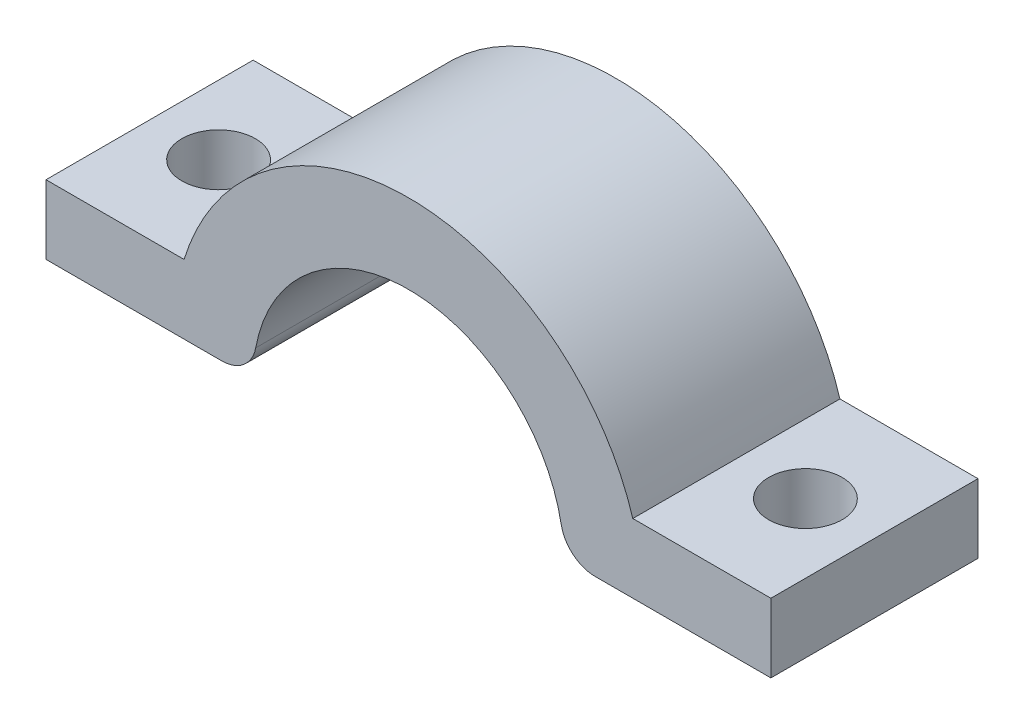
ISO-10303-21;
HEADER;
FILE_DESCRIPTION(('STEP AP214'),'2;1');
FILE_NAME('part.step','',(''),(''),'','','');
FILE_SCHEMA(('AUTOMOTIVE_DESIGN { 1 0 10303 214 1 1 1 1 }'));
ENDSEC;
DATA;
#1=APPLICATION_CONTEXT('core data for automotive mechanical design processes');
#2=APPLICATION_PROTOCOL_DEFINITION('international standard','automotive_design',2000,#1);
#3=PRODUCT_CONTEXT('',#1,'mechanical');
#4=PRODUCT('Part','Part','',(#3));
#5=PRODUCT_RELATED_PRODUCT_CATEGORY('part','',(#4));
#6=PRODUCT_DEFINITION_FORMATION('','',#4);
#7=PRODUCT_DEFINITION_CONTEXT('part definition',#1,'design');
#8=PRODUCT_DEFINITION('design','',#6,#7);
#9=PRODUCT_DEFINITION_SHAPE('','',#8);
#10=(LENGTH_UNIT() NAMED_UNIT(*) SI_UNIT(.MILLI.,.METRE.));
#11=(NAMED_UNIT(*) PLANE_ANGLE_UNIT() SI_UNIT($,.RADIAN.));
#12=(NAMED_UNIT(*) SI_UNIT($,.STERADIAN.) SOLID_ANGLE_UNIT());
#13=UNCERTAINTY_MEASURE_WITH_UNIT(LENGTH_MEASURE(1.E-05),#10,'distance_accuracy_value','');
#14=(GEOMETRIC_REPRESENTATION_CONTEXT(3) GLOBAL_UNCERTAINTY_ASSIGNED_CONTEXT((#13)) GLOBAL_UNIT_ASSIGNED_CONTEXT((#10,
#11,#12)) REPRESENTATION_CONTEXT('',''));
#15=CARTESIAN_POINT('',(0.,0.,0.));
#16=DIRECTION('',(0.,0.,1.));
#17=DIRECTION('',(1.,0.,0.));
#18=AXIS2_PLACEMENT_3D('',#15,#16,#17);
#19=CARTESIAN_POINT('',(0.,0.,19.05));
#20=DIRECTION('',(0.,0.,-1.));
#21=DIRECTION('',(-1.,0.,0.));
#22=AXIS2_PLACEMENT_3D('',#19,#20,#21);
#23=CYLINDRICAL_SURFACE('',#22,14.2875);
#24=CARTESIAN_POINT('',(0.,0.,19.05));
#25=DIRECTION('',(0.,0.,-1.));
#26=DIRECTION('',(-1.,0.,0.));
#27=AXIS2_PLACEMENT_3D('',#24,#25,#26);
#28=CIRCLE('',#27,14.2875);
#29=CARTESIAN_POINT('',(-14.0493583222341,2.59772727272727,19.05));
#30=VERTEX_POINT('',#29);
#31=CARTESIAN_POINT('',(14.0493583222341,2.59772727272727,19.05));
#32=VERTEX_POINT('',#31);
#33=EDGE_CURVE('E117',#30,#32,#28,.T.);
#34=ORIENTED_EDGE('',*,*,#33,.F.);
#35=DIRECTION('',(0.,0.,-1.));
#36=VECTOR('',#35,1.);
#37=CARTESIAN_POINT('',(-14.0493583222341,2.59772727272727,19.05));
#38=LINE('',#37,#36);
#39=CARTESIAN_POINT('',(-14.0493583222341,2.59772727272727,0.));
#40=VERTEX_POINT('',#39);
#41=EDGE_CURVE('E176',#30,#40,#38,.T.);
#42=ORIENTED_EDGE('',*,*,#41,.T.);
#43=CARTESIAN_POINT('',(0.,0.,0.));
#44=DIRECTION('',(0.,0.,-1.));
#45=DIRECTION('',(-1.,0.,0.));
#46=AXIS2_PLACEMENT_3D('',#43,#44,#45);
#47=CIRCLE('',#46,14.2875);
#48=CARTESIAN_POINT('',(14.0493583222341,2.59772727272727,0.));
#49=VERTEX_POINT('',#48);
#50=EDGE_CURVE('E146',#40,#49,#47,.T.);
#51=ORIENTED_EDGE('',*,*,#50,.T.);
#52=DIRECTION('',(0.,0.,-1.));
#53=VECTOR('',#52,1.);
#54=CARTESIAN_POINT('',(14.0493583222341,2.59772727272727,19.05));
#55=LINE('',#54,#53);
#56=EDGE_CURVE('E126',#49,#32,#55,.F.);
#57=ORIENTED_EDGE('',*,*,#56,.T.);
#58=EDGE_LOOP('',(#34,#42,#51,#57));
#59=FACE_BOUND('',#58,.T.);
#60=ADVANCED_FACE('F32',(#59),#23,.F.);
#61=CARTESIAN_POINT('',(14.2875,0.,19.05));
#62=DIRECTION('',(0.,1.,0.));
#63=DIRECTION('',(0.,0.,1.));
#64=AXIS2_PLACEMENT_3D('',#61,#62,#63);
#65=PLANE('',#64);
#66=CARTESIAN_POINT('',(26.9875,0.,9.525));
#67=DIRECTION('',(0.,1.,0.));
#68=DIRECTION('',(-1.,0.,0.));
#69=AXIS2_PLACEMENT_3D('',#66,#67,#68);
#70=CIRCLE('',#69,3.3782);
#71=CARTESIAN_POINT('',(23.6093,0.,9.525));
#72=VERTEX_POINT('',#71);
#73=EDGE_CURVE('E149',#72,#72,#70,.T.);
#74=ORIENTED_EDGE('',*,*,#73,.T.);
#75=EDGE_LOOP('',(#74));
#76=FACE_BOUND('',#75,.T.);
#77=DIRECTION('',(1.,0.,0.));
#78=VECTOR('',#77,1.);
#79=CARTESIAN_POINT('',(14.2875,0.,19.05));
#80=LINE('',#79,#78);
#81=CARTESIAN_POINT('',(17.1714379493972,0.,19.05));
#82=VERTEX_POINT('',#81);
#83=CARTESIAN_POINT('',(33.3375,0.,19.05));
#84=VERTEX_POINT('',#83);
#85=EDGE_CURVE('E109',#82,#84,#80,.T.);
#86=ORIENTED_EDGE('',*,*,#85,.F.);
#87=DIRECTION('',(0.,0.,-1.));
#88=VECTOR('',#87,1.);
#89=CARTESIAN_POINT('',(17.1714379493972,0.,19.05));
#90=LINE('',#89,#88);
#91=CARTESIAN_POINT('',(17.1714379493972,0.,0.));
#92=VERTEX_POINT('',#91);
#93=EDGE_CURVE('E11',#82,#92,#90,.T.);
#94=ORIENTED_EDGE('',*,*,#93,.T.);
#95=DIRECTION('',(1.,0.,0.));
#96=VECTOR('',#95,1.);
#97=CARTESIAN_POINT('',(14.2875,0.,0.));
#98=LINE('',#97,#96);
#99=CARTESIAN_POINT('',(33.3375,0.,0.));
#100=VERTEX_POINT('',#99);
#101=EDGE_CURVE('E123',#92,#100,#98,.T.);
#102=ORIENTED_EDGE('',*,*,#101,.T.);
#103=DIRECTION('',(0.,0.,-1.));
#104=VECTOR('',#103,1.);
#105=CARTESIAN_POINT('',(33.3375,0.,19.05));
#106=LINE('',#105,#104);
#107=EDGE_CURVE('E120',#84,#100,#106,.T.);
#108=ORIENTED_EDGE('',*,*,#107,.F.);
#109=EDGE_LOOP('',(#86,#94,#102,#108));
#110=FACE_BOUND('',#109,.T.);
#111=ADVANCED_FACE('F121',(#76,#110),#65,.F.);
#112=CARTESIAN_POINT('',(33.3375,0.,19.05));
#113=DIRECTION('',(-1.,0.,0.));
#114=DIRECTION('',(0.,0.,1.));
#115=AXIS2_PLACEMENT_3D('',#112,#113,#114);
#116=PLANE('',#115);
#117=DIRECTION('',(0.,1.,0.));
#118=VECTOR('',#117,1.);
#119=CARTESIAN_POINT('',(33.3375,0.,0.));
#120=LINE('',#119,#118);
#121=CARTESIAN_POINT('',(33.3375,6.35,0.));
#122=VERTEX_POINT('',#121);
#123=EDGE_CURVE('E151',#100,#122,#120,.T.);
#124=ORIENTED_EDGE('',*,*,#123,.T.);
#125=DIRECTION('',(0.,0.,-1.));
#126=VECTOR('',#125,1.);
#127=CARTESIAN_POINT('',(33.3375,6.35,19.05));
#128=LINE('',#127,#126);
#129=CARTESIAN_POINT('',(33.3375,6.35,19.05));
#130=VERTEX_POINT('',#129);
#131=EDGE_CURVE('E127',#130,#122,#128,.T.);
#132=ORIENTED_EDGE('',*,*,#131,.F.);
#133=DIRECTION('',(0.,1.,0.));
#134=VECTOR('',#133,1.);
#135=CARTESIAN_POINT('',(33.3375,0.,19.05));
#136=LINE('',#135,#134);
#137=EDGE_CURVE('E113',#84,#130,#136,.T.);
#138=ORIENTED_EDGE('',*,*,#137,.F.);
#139=ORIENTED_EDGE('',*,*,#107,.T.);
#140=EDGE_LOOP('',(#124,#132,#138,#139));
#141=FACE_BOUND('',#140,.T.);
#142=ADVANCED_FACE('F129',(#141),#116,.F.);
#143=CARTESIAN_POINT('',(33.3375,6.35,19.05));
#144=DIRECTION('',(0.,-1.,0.));
#145=DIRECTION('',(1.,0.,0.));
#146=AXIS2_PLACEMENT_3D('',#143,#144,#145);
#147=PLANE('',#146);
#148=CARTESIAN_POINT('',(26.9875,6.35,9.525));
#149=DIRECTION('',(0.,1.,0.));
#150=DIRECTION('',(-1.,0.,0.));
#151=AXIS2_PLACEMENT_3D('',#148,#149,#150);
#152=CIRCLE('',#151,3.3782);
#153=CARTESIAN_POINT('',(23.6093,6.35,9.525));
#154=VERTEX_POINT('',#153);
#155=EDGE_CURVE('E261',#154,#154,#152,.T.);
#156=ORIENTED_EDGE('',*,*,#155,.F.);
#157=EDGE_LOOP('',(#156));
#158=FACE_BOUND('',#157,.T.);
#159=DIRECTION('',(-1.,0.,0.));
#160=VECTOR('',#159,1.);
#161=CARTESIAN_POINT('',(33.3375,6.35,0.));
#162=LINE('',#161,#160);
#163=CARTESIAN_POINT('',(20.6375,6.35,0.));
#164=VERTEX_POINT('',#163);
#165=EDGE_CURVE('E153',#122,#164,#162,.T.);
#166=ORIENTED_EDGE('',*,*,#165,.T.);
#167=DIRECTION('',(0.,0.,-1.));
#168=VECTOR('',#167,1.);
#169=CARTESIAN_POINT('',(20.6375,6.35,19.05));
#170=LINE('',#169,#168);
#171=CARTESIAN_POINT('',(20.6375,6.35,19.05));
#172=VERTEX_POINT('',#171);
#173=EDGE_CURVE('E171',#172,#164,#170,.T.);
#174=ORIENTED_EDGE('',*,*,#173,.F.);
#175=DIRECTION('',(-1.,0.,0.));
#176=VECTOR('',#175,1.);
#177=CARTESIAN_POINT('',(33.3375,6.35,19.05));
#178=LINE('',#177,#176);
#179=EDGE_CURVE('E132',#130,#172,#178,.T.);
#180=ORIENTED_EDGE('',*,*,#179,.F.);
#181=ORIENTED_EDGE('',*,*,#131,.T.);
#182=EDGE_LOOP('',(#166,#174,#180,#181));
#183=FACE_BOUND('',#182,.T.);
#184=ADVANCED_FACE('F214',(#158,#183),#147,.F.);
#185=CARTESIAN_POINT('',(0.,0.,19.05));
#186=DIRECTION('',(0.,0.,-1.));
#187=DIRECTION('',(-1.,0.,0.));
#188=AXIS2_PLACEMENT_3D('',#185,#186,#187);
#189=CYLINDRICAL_SURFACE('',#188,21.5923344326175);
#190=CARTESIAN_POINT('',(0.,0.,0.));
#191=DIRECTION('',(0.,0.,1.));
#192=DIRECTION('',(1.,0.,0.));
#193=AXIS2_PLACEMENT_3D('',#190,#191,#192);
#194=CIRCLE('',#193,21.5923344326175);
#195=CARTESIAN_POINT('',(-20.6375,6.34999999999999,0.));
#196=VERTEX_POINT('',#195);
#197=EDGE_CURVE('E155',#164,#196,#194,.T.);
#198=ORIENTED_EDGE('',*,*,#197,.T.);
#199=DIRECTION('',(0.,0.,-1.));
#200=VECTOR('',#199,1.);
#201=CARTESIAN_POINT('',(-20.6375,6.34999999999999,19.05));
#202=LINE('',#201,#200);
#203=CARTESIAN_POINT('',(-20.6375,6.34999999999999,19.05));
#204=VERTEX_POINT('',#203);
#205=EDGE_CURVE('E168',#204,#196,#202,.T.);
#206=ORIENTED_EDGE('',*,*,#205,.F.);
#207=CARTESIAN_POINT('',(0.,0.,19.05));
#208=DIRECTION('',(0.,0.,1.));
#209=DIRECTION('',(1.,0.,0.));
#210=AXIS2_PLACEMENT_3D('',#207,#208,#209);
#211=CIRCLE('',#210,21.5923344326175);
#212=EDGE_CURVE('E134',#172,#204,#211,.T.);
#213=ORIENTED_EDGE('',*,*,#212,.F.);
#214=ORIENTED_EDGE('',*,*,#173,.T.);
#215=EDGE_LOOP('',(#198,#206,#213,#214));
#216=FACE_BOUND('',#215,.T.);
#217=ADVANCED_FACE('F211',(#216),#189,.T.);
#218=CARTESIAN_POINT('',(-33.3375,6.35,19.05));
#219=DIRECTION('',(0.,-1.,0.));
#220=DIRECTION('',(1.,0.,0.));
#221=AXIS2_PLACEMENT_3D('',#218,#219,#220);
#222=PLANE('',#221);
#223=CARTESIAN_POINT('',(-26.9875,6.34999999999999,9.525));
#224=DIRECTION('',(0.,1.,0.));
#225=DIRECTION('',(-1.,0.,0.));
#226=AXIS2_PLACEMENT_3D('',#223,#224,#225);
#227=CIRCLE('',#226,3.3782);
#228=CARTESIAN_POINT('',(-30.3657,6.34999999999999,9.525));
#229=VERTEX_POINT('',#228);
#230=EDGE_CURVE('E266',#229,#229,#227,.T.);
#231=ORIENTED_EDGE('',*,*,#230,.F.);
#232=EDGE_LOOP('',(#231));
#233=FACE_BOUND('',#232,.T.);
#234=DIRECTION('',(-1.,0.,0.));
#235=VECTOR('',#234,1.);
#236=CARTESIAN_POINT('',(-33.3375,6.35,0.));
#237=LINE('',#236,#235);
#238=CARTESIAN_POINT('',(-33.3375,6.35,0.));
#239=VERTEX_POINT('',#238);
#240=EDGE_CURVE('E157',#196,#239,#237,.T.);
#241=ORIENTED_EDGE('',*,*,#240,.T.);
#242=DIRECTION('',(0.,0.,-1.));
#243=VECTOR('',#242,1.);
#244=CARTESIAN_POINT('',(-33.3375,6.35,19.05));
#245=LINE('',#244,#243);
#246=CARTESIAN_POINT('',(-33.3375,6.35,19.05));
#247=VERTEX_POINT('',#246);
#248=EDGE_CURVE('E165',#247,#239,#245,.T.);
#249=ORIENTED_EDGE('',*,*,#248,.F.);
#250=DIRECTION('',(-1.,0.,0.));
#251=VECTOR('',#250,1.);
#252=CARTESIAN_POINT('',(-33.3375,6.35,19.05));
#253=LINE('',#252,#251);
#254=EDGE_CURVE('E139',#204,#247,#253,.T.);
#255=ORIENTED_EDGE('',*,*,#254,.F.);
#256=ORIENTED_EDGE('',*,*,#205,.T.);
#257=EDGE_LOOP('',(#241,#249,#255,#256));
#258=FACE_BOUND('',#257,.T.);
#259=ADVANCED_FACE('F206',(#233,#258),#222,.F.);
#260=CARTESIAN_POINT('',(-33.3375,0.,19.05));
#261=DIRECTION('',(1.,0.,0.));
#262=DIRECTION('',(0.,0.,-1.));
#263=AXIS2_PLACEMENT_3D('',#260,#261,#262);
#264=PLANE('',#263);
#265=DIRECTION('',(0.,-1.,0.));
#266=VECTOR('',#265,1.);
#267=CARTESIAN_POINT('',(-33.3375,0.,0.));
#268=LINE('',#267,#266);
#269=CARTESIAN_POINT('',(-33.3375,0.,0.));
#270=VERTEX_POINT('',#269);
#271=EDGE_CURVE('E159',#239,#270,#268,.T.);
#272=ORIENTED_EDGE('',*,*,#271,.T.);
#273=DIRECTION('',(0.,0.,-1.));
#274=VECTOR('',#273,1.);
#275=CARTESIAN_POINT('',(-33.3375,0.,19.05));
#276=LINE('',#275,#274);
#277=CARTESIAN_POINT('',(-33.3375,0.,19.05));
#278=VERTEX_POINT('',#277);
#279=EDGE_CURVE('E145',#278,#270,#276,.T.);
#280=ORIENTED_EDGE('',*,*,#279,.F.);
#281=DIRECTION('',(0.,-1.,0.));
#282=VECTOR('',#281,1.);
#283=CARTESIAN_POINT('',(-33.3375,0.,19.05));
#284=LINE('',#283,#282);
#285=EDGE_CURVE('E141',#247,#278,#284,.T.);
#286=ORIENTED_EDGE('',*,*,#285,.F.);
#287=ORIENTED_EDGE('',*,*,#248,.T.);
#288=EDGE_LOOP('',(#272,#280,#286,#287));
#289=FACE_BOUND('',#288,.T.);
#290=ADVANCED_FACE('F200',(#289),#264,.F.);
#291=CARTESIAN_POINT('',(-14.2875,0.,19.05));
#292=DIRECTION('',(0.,1.,0.));
#293=DIRECTION('',(-1.,0.,0.));
#294=AXIS2_PLACEMENT_3D('',#291,#292,#293);
#295=PLANE('',#294);
#296=CARTESIAN_POINT('',(-26.9875,0.,9.525));
#297=DIRECTION('',(0.,1.,0.));
#298=DIRECTION('',(-1.,0.,0.));
#299=AXIS2_PLACEMENT_3D('',#296,#297,#298);
#300=CIRCLE('',#299,3.3782);
#301=CARTESIAN_POINT('',(-30.3657,0.,9.525));
#302=VERTEX_POINT('',#301);
#303=EDGE_CURVE('E262',#302,#302,#300,.T.);
#304=ORIENTED_EDGE('',*,*,#303,.T.);
#305=EDGE_LOOP('',(#304));
#306=FACE_BOUND('',#305,.T.);
#307=DIRECTION('',(1.,0.,0.));
#308=VECTOR('',#307,1.);
#309=CARTESIAN_POINT('',(-14.2875,0.,0.));
#310=LINE('',#309,#308);
#311=CARTESIAN_POINT('',(-17.1714379493972,0.,0.));
#312=VERTEX_POINT('',#311);
#313=EDGE_CURVE('E161',#270,#312,#310,.T.);
#314=ORIENTED_EDGE('',*,*,#313,.T.);
#315=DIRECTION('',(0.,0.,-1.));
#316=VECTOR('',#315,1.);
#317=CARTESIAN_POINT('',(-17.1714379493972,0.,19.05));
#318=LINE('',#317,#316);
#319=CARTESIAN_POINT('',(-17.1714379493972,0.,19.05));
#320=VERTEX_POINT('',#319);
#321=EDGE_CURVE('E55',#312,#320,#318,.F.);
#322=ORIENTED_EDGE('',*,*,#321,.T.);
#323=DIRECTION('',(1.,0.,0.));
#324=VECTOR('',#323,1.);
#325=CARTESIAN_POINT('',(-14.2875,0.,19.05));
#326=LINE('',#325,#324);
#327=EDGE_CURVE('E143',#278,#320,#326,.T.);
#328=ORIENTED_EDGE('',*,*,#327,.F.);
#329=ORIENTED_EDGE('',*,*,#279,.T.);
#330=EDGE_LOOP('',(#314,#322,#328,#329));
#331=FACE_BOUND('',#330,.T.);
#332=ADVANCED_FACE('F196',(#306,#331),#295,.F.);
#333=CARTESIAN_POINT('',(0.,0.,19.05));
#334=DIRECTION('',(0.,0.,-1.));
#335=DIRECTION('',(-1.,0.,0.));
#336=AXIS2_PLACEMENT_3D('',#333,#334,#335);
#337=PLANE('',#336);
#338=ORIENTED_EDGE('',*,*,#327,.T.);
#339=CARTESIAN_POINT('',(-17.1714379493972,3.175,19.05));
#340=DIRECTION('',(0.,0.,-1.));
#341=DIRECTION('',(-1.,0.,0.));
#342=AXIS2_PLACEMENT_3D('',#339,#340,#341);
#343=CIRCLE('',#342,3.175);
#344=EDGE_CURVE('E40',#320,#30,#343,.F.);
#345=ORIENTED_EDGE('',*,*,#344,.T.);
#346=ORIENTED_EDGE('',*,*,#33,.T.);
#347=CARTESIAN_POINT('',(17.1714379493972,3.175,19.05));
#348=DIRECTION('',(0.,0.,-1.));
#349=DIRECTION('',(-1.,0.,0.));
#350=AXIS2_PLACEMENT_3D('',#347,#348,#349);
#351=CIRCLE('',#350,3.175);
#352=EDGE_CURVE('E47',#32,#82,#351,.F.);
#353=ORIENTED_EDGE('',*,*,#352,.T.);
#354=ORIENTED_EDGE('',*,*,#85,.T.);
#355=ORIENTED_EDGE('',*,*,#137,.T.);
#356=ORIENTED_EDGE('',*,*,#179,.T.);
#357=ORIENTED_EDGE('',*,*,#212,.T.);
#358=ORIENTED_EDGE('',*,*,#254,.T.);
#359=ORIENTED_EDGE('',*,*,#285,.T.);
#360=EDGE_LOOP('',(#338,#345,#346,#353,#354,#355,#356,#357,#358,#359));
#361=FACE_BOUND('',#360,.T.);
#362=ADVANCED_FACE('F111',(#361),#337,.F.);
#363=CARTESIAN_POINT('',(0.,0.,0.));
#364=DIRECTION('',(0.,0.,-1.));
#365=DIRECTION('',(-1.,0.,0.));
#366=AXIS2_PLACEMENT_3D('',#363,#364,#365);
#367=PLANE('',#366);
#368=ORIENTED_EDGE('',*,*,#50,.F.);
#369=CARTESIAN_POINT('',(-17.1714379493972,3.175,0.));
#370=DIRECTION('',(0.,0.,-1.));
#371=DIRECTION('',(-1.,0.,0.));
#372=AXIS2_PLACEMENT_3D('',#369,#370,#371);
#373=CIRCLE('',#372,3.175);
#374=EDGE_CURVE('E181',#40,#312,#373,.T.);
#375=ORIENTED_EDGE('',*,*,#374,.T.);
#376=ORIENTED_EDGE('',*,*,#313,.F.);
#377=ORIENTED_EDGE('',*,*,#271,.F.);
#378=ORIENTED_EDGE('',*,*,#240,.F.);
#379=ORIENTED_EDGE('',*,*,#197,.F.);
#380=ORIENTED_EDGE('',*,*,#165,.F.);
#381=ORIENTED_EDGE('',*,*,#123,.F.);
#382=ORIENTED_EDGE('',*,*,#101,.F.);
#383=CARTESIAN_POINT('',(17.1714379493972,3.175,0.));
#384=DIRECTION('',(0.,0.,-1.));
#385=DIRECTION('',(-1.,0.,0.));
#386=AXIS2_PLACEMENT_3D('',#383,#384,#385);
#387=CIRCLE('',#386,3.175);
#388=EDGE_CURVE('E179',#92,#49,#387,.T.);
#389=ORIENTED_EDGE('',*,*,#388,.T.);
#390=EDGE_LOOP('',(#368,#375,#376,#377,#378,#379,#380,#381,#382,#389));
#391=FACE_BOUND('',#390,.T.);
#392=ADVANCED_FACE('F194',(#391),#367,.T.);
#393=CARTESIAN_POINT('',(-26.9875,0.,9.525));
#394=DIRECTION('',(0.,1.,0.));
#395=DIRECTION('',(-1.,0.,0.));
#396=AXIS2_PLACEMENT_3D('',#393,#394,#395);
#397=CYLINDRICAL_SURFACE('',#396,3.3782);
#398=ORIENTED_EDGE('',*,*,#303,.F.);
#399=EDGE_LOOP('',(#398));
#400=FACE_BOUND('',#399,.T.);
#401=ORIENTED_EDGE('',*,*,#230,.T.);
#402=EDGE_LOOP('',(#401));
#403=FACE_BOUND('',#402,.T.);
#404=ADVANCED_FACE('F247',(#400,#403),#397,.F.);
#405=CARTESIAN_POINT('',(26.9875,0.,9.525));
#406=DIRECTION('',(0.,1.,0.));
#407=DIRECTION('',(-1.,0.,0.));
#408=AXIS2_PLACEMENT_3D('',#405,#406,#407);
#409=CYLINDRICAL_SURFACE('',#408,3.3782);
#410=ORIENTED_EDGE('',*,*,#73,.F.);
#411=EDGE_LOOP('',(#410));
#412=FACE_BOUND('',#411,.T.);
#413=ORIENTED_EDGE('',*,*,#155,.T.);
#414=EDGE_LOOP('',(#413));
#415=FACE_BOUND('',#414,.T.);
#416=ADVANCED_FACE('F220',(#412,#415),#409,.F.);
#417=CARTESIAN_POINT('',(-17.1714379493972,3.175,19.05));
#418=DIRECTION('',(0.,0.,-1.));
#419=DIRECTION('',(-1.,0.,0.));
#420=AXIS2_PLACEMENT_3D('',#417,#418,#419);
#421=CYLINDRICAL_SURFACE('',#420,3.175);
#422=ORIENTED_EDGE('',*,*,#344,.F.);
#423=ORIENTED_EDGE('',*,*,#321,.F.);
#424=ORIENTED_EDGE('',*,*,#374,.F.);
#425=ORIENTED_EDGE('',*,*,#41,.F.);
#426=EDGE_LOOP('',(#422,#423,#424,#425));
#427=FACE_BOUND('',#426,.T.);
#428=ADVANCED_FACE('F191',(#427),#421,.T.);
#429=CARTESIAN_POINT('',(17.1714379493972,3.175,19.05));
#430=DIRECTION('',(0.,0.,-1.));
#431=DIRECTION('',(-1.,0.,0.));
#432=AXIS2_PLACEMENT_3D('',#429,#430,#431);
#433=CYLINDRICAL_SURFACE('',#432,3.175);
#434=ORIENTED_EDGE('',*,*,#352,.F.);
#435=ORIENTED_EDGE('',*,*,#56,.F.);
#436=ORIENTED_EDGE('',*,*,#388,.F.);
#437=ORIENTED_EDGE('',*,*,#93,.F.);
#438=EDGE_LOOP('',(#434,#435,#436,#437));
#439=FACE_BOUND('',#438,.T.);
#440=ADVANCED_FACE('F34',(#439),#433,.T.);
#441=CLOSED_SHELL('',(#60,#111,#142,#184,#217,#259,#290,#332,#362,#392,#404,#416,#428,#440));
#442=MANIFOLD_SOLID_BREP('B2',#441);
#443=ADVANCED_BREP_SHAPE_REPRESENTATION('',(#18,#442),#14);
#444=SHAPE_DEFINITION_REPRESENTATION(#9,#443);
ENDSEC;
END-ISO-10303-21;
